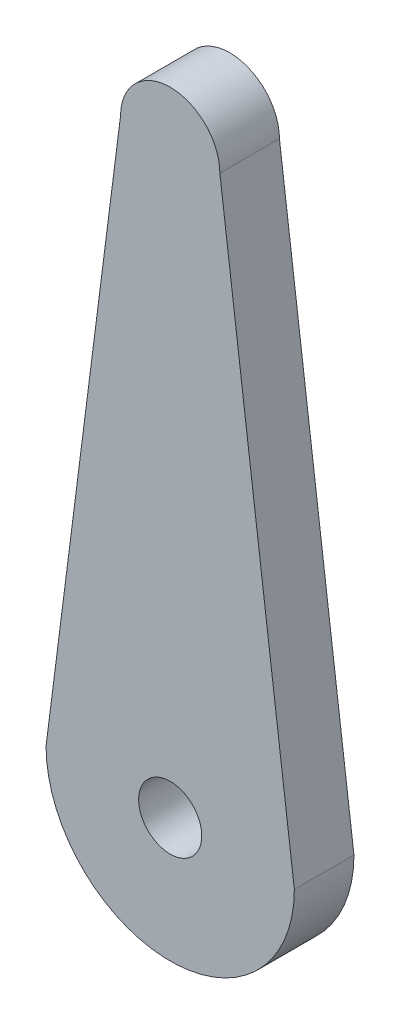
ISO-10303-21;
HEADER;
FILE_DESCRIPTION(('STEP AP214'),'2;1');
FILE_NAME('part.step','',(''),(''),'','','');
FILE_SCHEMA(('AUTOMOTIVE_DESIGN { 1 0 10303 214 1 1 1 1 }'));
ENDSEC;
DATA;
#1=APPLICATION_CONTEXT('core data for automotive mechanical design processes');
#2=APPLICATION_PROTOCOL_DEFINITION('international standard','automotive_design',2000,#1);
#3=PRODUCT_CONTEXT('',#1,'mechanical');
#4=PRODUCT('Part','Part','',(#3));
#5=PRODUCT_RELATED_PRODUCT_CATEGORY('part','',(#4));
#6=PRODUCT_DEFINITION_FORMATION('','',#4);
#7=PRODUCT_DEFINITION_CONTEXT('part definition',#1,'design');
#8=PRODUCT_DEFINITION('design','',#6,#7);
#9=PRODUCT_DEFINITION_SHAPE('','',#8);
#10=(LENGTH_UNIT() NAMED_UNIT(*) SI_UNIT(.MILLI.,.METRE.));
#11=(NAMED_UNIT(*) PLANE_ANGLE_UNIT() SI_UNIT($,.RADIAN.));
#12=(NAMED_UNIT(*) SI_UNIT($,.STERADIAN.) SOLID_ANGLE_UNIT());
#13=UNCERTAINTY_MEASURE_WITH_UNIT(LENGTH_MEASURE(1.E-05),#10,'distance_accuracy_value','');
#14=(GEOMETRIC_REPRESENTATION_CONTEXT(3) GLOBAL_UNCERTAINTY_ASSIGNED_CONTEXT((#13)) GLOBAL_UNIT_ASSIGNED_CONTEXT((#10,
#11,#12)) REPRESENTATION_CONTEXT('',''));
#15=CARTESIAN_POINT('',(0.,0.,0.));
#16=DIRECTION('',(0.,0.,1.));
#17=DIRECTION('',(1.,0.,0.));
#18=AXIS2_PLACEMENT_3D('',#15,#16,#17);
#19=CARTESIAN_POINT('',(0.,0.,6.));
#20=DIRECTION('',(0.,0.,-1.));
#21=DIRECTION('',(-1.,0.,0.));
#22=AXIS2_PLACEMENT_3D('',#19,#20,#21);
#23=CYLINDRICAL_SURFACE('',#22,12.5);
#24=CARTESIAN_POINT('',(0.,0.,0.));
#25=DIRECTION('',(0.,0.,1.));
#26=DIRECTION('',(1.,0.,0.));
#27=AXIS2_PLACEMENT_3D('',#24,#25,#26);
#28=CIRCLE('',#27,12.5);
#29=CARTESIAN_POINT('',(-12.5,0.,0.));
#30=VERTEX_POINT('',#29);
#31=CARTESIAN_POINT('',(12.5,0.,0.));
#32=VERTEX_POINT('',#31);
#33=EDGE_CURVE('E106',#30,#32,#28,.T.);
#34=ORIENTED_EDGE('',*,*,#33,.T.);
#35=DIRECTION('',(0.,0.,-1.));
#36=VECTOR('',#35,1.);
#37=CARTESIAN_POINT('',(12.5,0.,6.));
#38=LINE('',#37,#36);
#39=CARTESIAN_POINT('',(12.5,0.,6.));
#40=VERTEX_POINT('',#39);
#41=EDGE_CURVE('E11',#40,#32,#38,.T.);
#42=ORIENTED_EDGE('',*,*,#41,.F.);
#43=CARTESIAN_POINT('',(0.,0.,6.));
#44=DIRECTION('',(0.,0.,1.));
#45=DIRECTION('',(1.,0.,0.));
#46=AXIS2_PLACEMENT_3D('',#43,#44,#45);
#47=CIRCLE('',#46,12.5);
#48=CARTESIAN_POINT('',(-12.5,0.,6.));
#49=VERTEX_POINT('',#48);
#50=EDGE_CURVE('E93',#49,#40,#47,.T.);
#51=ORIENTED_EDGE('',*,*,#50,.F.);
#52=DIRECTION('',(0.,0.,-1.));
#53=VECTOR('',#52,1.);
#54=CARTESIAN_POINT('',(-12.5,0.,6.));
#55=LINE('',#54,#53);
#56=EDGE_CURVE('E102',#49,#30,#55,.T.);
#57=ORIENTED_EDGE('',*,*,#56,.T.);
#58=EDGE_LOOP('',(#34,#42,#51,#57));
#59=FACE_BOUND('',#58,.T.);
#60=ADVANCED_FACE('F41',(#59),#23,.T.);
#61=CARTESIAN_POINT('',(12.5,0.,6.));
#62=DIRECTION('',(-0.991936225095598,-0.12673801853862,0.));
#63=DIRECTION('',(0.12673801853862,-0.991936225095598,0.));
#64=AXIS2_PLACEMENT_3D('',#61,#62,#63);
#65=PLANE('',#64);
#66=DIRECTION('',(-0.12673801853862,0.991936225095598,0.));
#67=VECTOR('',#66,1.);
#68=CARTESIAN_POINT('',(12.5,0.,0.));
#69=LINE('',#68,#67);
#70=CARTESIAN_POINT('',(5.,58.7,0.));
#71=VERTEX_POINT('',#70);
#72=EDGE_CURVE('E97',#32,#71,#69,.T.);
#73=ORIENTED_EDGE('',*,*,#72,.T.);
#74=DIRECTION('',(0.,0.,-1.));
#75=VECTOR('',#74,1.);
#76=CARTESIAN_POINT('',(5.,58.7,6.));
#77=LINE('',#76,#75);
#78=CARTESIAN_POINT('',(5.,58.7,6.));
#79=VERTEX_POINT('',#78);
#80=EDGE_CURVE('E50',#79,#71,#77,.T.);
#81=ORIENTED_EDGE('',*,*,#80,.F.);
#82=DIRECTION('',(-0.12673801853862,0.991936225095598,0.));
#83=VECTOR('',#82,1.);
#84=CARTESIAN_POINT('',(12.5,0.,6.));
#85=LINE('',#84,#83);
#86=EDGE_CURVE('E88',#40,#79,#85,.T.);
#87=ORIENTED_EDGE('',*,*,#86,.F.);
#88=ORIENTED_EDGE('',*,*,#41,.T.);
#89=EDGE_LOOP('',(#73,#81,#87,#88));
#90=FACE_BOUND('',#89,.T.);
#91=ADVANCED_FACE('F96',(#90),#65,.F.);
#92=CARTESIAN_POINT('',(0.,58.7,6.));
#93=DIRECTION('',(0.,0.,-1.));
#94=DIRECTION('',(-1.,0.,0.));
#95=AXIS2_PLACEMENT_3D('',#92,#93,#94);
#96=CYLINDRICAL_SURFACE('',#95,5.);
#97=CARTESIAN_POINT('',(0.,58.7,0.));
#98=DIRECTION('',(0.,0.,1.));
#99=DIRECTION('',(1.,0.,0.));
#100=AXIS2_PLACEMENT_3D('',#97,#98,#99);
#101=CIRCLE('',#100,5.);
#102=CARTESIAN_POINT('',(-5.,58.7,0.));
#103=VERTEX_POINT('',#102);
#104=EDGE_CURVE('E75',#71,#103,#101,.T.);
#105=ORIENTED_EDGE('',*,*,#104,.T.);
#106=DIRECTION('',(0.,0.,-1.));
#107=VECTOR('',#106,1.);
#108=CARTESIAN_POINT('',(-5.,58.7,6.));
#109=LINE('',#108,#107);
#110=CARTESIAN_POINT('',(-5.,58.7,6.));
#111=VERTEX_POINT('',#110);
#112=EDGE_CURVE('E98',#111,#103,#109,.T.);
#113=ORIENTED_EDGE('',*,*,#112,.F.);
#114=CARTESIAN_POINT('',(0.,58.7,6.));
#115=DIRECTION('',(0.,0.,1.));
#116=DIRECTION('',(1.,0.,0.));
#117=AXIS2_PLACEMENT_3D('',#114,#115,#116);
#118=CIRCLE('',#117,5.);
#119=EDGE_CURVE('E91',#79,#111,#118,.T.);
#120=ORIENTED_EDGE('',*,*,#119,.F.);
#121=ORIENTED_EDGE('',*,*,#80,.T.);
#122=EDGE_LOOP('',(#105,#113,#120,#121));
#123=FACE_BOUND('',#122,.T.);
#124=ADVANCED_FACE('F100',(#123),#96,.T.);
#125=CARTESIAN_POINT('',(-12.5,0.,6.));
#126=DIRECTION('',(0.991936225095598,-0.12673801853862,0.));
#127=DIRECTION('',(0.12673801853862,0.991936225095598,0.));
#128=AXIS2_PLACEMENT_3D('',#125,#126,#127);
#129=PLANE('',#128);
#130=DIRECTION('',(-0.12673801853862,-0.991936225095598,0.));
#131=VECTOR('',#130,1.);
#132=CARTESIAN_POINT('',(-12.5,0.,0.));
#133=LINE('',#132,#131);
#134=EDGE_CURVE('E81',#103,#30,#133,.T.);
#135=ORIENTED_EDGE('',*,*,#134,.T.);
#136=ORIENTED_EDGE('',*,*,#56,.F.);
#137=DIRECTION('',(-0.12673801853862,-0.991936225095598,0.));
#138=VECTOR('',#137,1.);
#139=CARTESIAN_POINT('',(-12.5,0.,6.));
#140=LINE('',#139,#138);
#141=EDGE_CURVE('E58',#111,#49,#140,.T.);
#142=ORIENTED_EDGE('',*,*,#141,.F.);
#143=ORIENTED_EDGE('',*,*,#112,.T.);
#144=EDGE_LOOP('',(#135,#136,#142,#143));
#145=FACE_BOUND('',#144,.T.);
#146=ADVANCED_FACE('F113',(#145),#129,.F.);
#147=CARTESIAN_POINT('',(0.,0.,6.));
#148=DIRECTION('',(0.,0.,1.));
#149=DIRECTION('',(1.,0.,0.));
#150=AXIS2_PLACEMENT_3D('',#147,#148,#149);
#151=PLANE('',#150);
#152=CARTESIAN_POINT('',(0.,0.,6.));
#153=DIRECTION('',(0.,0.,1.));
#154=DIRECTION('',(1.,0.,0.));
#155=AXIS2_PLACEMENT_3D('',#152,#153,#154);
#156=CIRCLE('',#155,3.175);
#157=CARTESIAN_POINT('',(3.175,0.,6.));
#158=VERTEX_POINT('',#157);
#159=EDGE_CURVE('E119',#158,#158,#156,.T.);
#160=ORIENTED_EDGE('',*,*,#159,.F.);
#161=EDGE_LOOP('',(#160));
#162=FACE_BOUND('',#161,.T.);
#163=ORIENTED_EDGE('',*,*,#50,.T.);
#164=ORIENTED_EDGE('',*,*,#86,.T.);
#165=ORIENTED_EDGE('',*,*,#119,.T.);
#166=ORIENTED_EDGE('',*,*,#141,.T.);
#167=EDGE_LOOP('',(#163,#164,#165,#166));
#168=FACE_BOUND('',#167,.T.);
#169=ADVANCED_FACE('F89',(#162,#168),#151,.T.);
#170=CARTESIAN_POINT('',(0.,0.,0.));
#171=DIRECTION('',(0.,0.,1.));
#172=DIRECTION('',(1.,0.,0.));
#173=AXIS2_PLACEMENT_3D('',#170,#171,#172);
#174=PLANE('',#173);
#175=CARTESIAN_POINT('',(0.,0.,0.));
#176=DIRECTION('',(0.,0.,1.));
#177=DIRECTION('',(1.,0.,0.));
#178=AXIS2_PLACEMENT_3D('',#175,#176,#177);
#179=CIRCLE('',#178,3.175);
#180=CARTESIAN_POINT('',(3.175,0.,0.));
#181=VERTEX_POINT('',#180);
#182=EDGE_CURVE('E44',#181,#181,#179,.T.);
#183=ORIENTED_EDGE('',*,*,#182,.T.);
#184=EDGE_LOOP('',(#183));
#185=FACE_BOUND('',#184,.T.);
#186=ORIENTED_EDGE('',*,*,#33,.F.);
#187=ORIENTED_EDGE('',*,*,#134,.F.);
#188=ORIENTED_EDGE('',*,*,#104,.F.);
#189=ORIENTED_EDGE('',*,*,#72,.F.);
#190=EDGE_LOOP('',(#186,#187,#188,#189));
#191=FACE_BOUND('',#190,.T.);
#192=ADVANCED_FACE('F116',(#185,#191),#174,.F.);
#193=CARTESIAN_POINT('',(0.,0.,-15.));
#194=DIRECTION('',(0.,0.,1.));
#195=DIRECTION('',(1.,0.,0.));
#196=AXIS2_PLACEMENT_3D('',#193,#194,#195);
#197=CYLINDRICAL_SURFACE('',#196,3.175);
#198=CARTESIAN_POINT('',(3.175,0.,6.));
#199=CARTESIAN_POINT('',(3.175,0.,5.9375));
#200=CARTESIAN_POINT('',(3.175,0.,5.875));
#201=CARTESIAN_POINT('',(3.175,0.,5.75));
#202=CARTESIAN_POINT('',(3.175,0.,5.6875));
#203=CARTESIAN_POINT('',(3.175,0.,5.5625));
#204=CARTESIAN_POINT('',(3.175,0.,5.5));
#205=CARTESIAN_POINT('',(3.175,0.,5.375));
#206=CARTESIAN_POINT('',(3.175,0.,5.3125));
#207=CARTESIAN_POINT('',(3.175,0.,5.1875));
#208=CARTESIAN_POINT('',(3.175,0.,5.125));
#209=CARTESIAN_POINT('',(3.175,0.,5.));
#210=CARTESIAN_POINT('',(3.175,0.,4.9375));
#211=CARTESIAN_POINT('',(3.175,0.,4.8125));
#212=CARTESIAN_POINT('',(3.175,0.,4.75));
#213=CARTESIAN_POINT('',(3.175,0.,4.625));
#214=CARTESIAN_POINT('',(3.175,0.,4.5625));
#215=CARTESIAN_POINT('',(3.175,0.,4.4375));
#216=CARTESIAN_POINT('',(3.175,0.,4.375));
#217=CARTESIAN_POINT('',(3.175,0.,4.25));
#218=CARTESIAN_POINT('',(3.175,0.,4.1875));
#219=CARTESIAN_POINT('',(3.175,0.,4.0625));
#220=CARTESIAN_POINT('',(3.175,0.,4.));
#221=CARTESIAN_POINT('',(3.175,0.,3.875));
#222=CARTESIAN_POINT('',(3.175,0.,3.8125));
#223=CARTESIAN_POINT('',(3.175,0.,3.6875));
#224=CARTESIAN_POINT('',(3.175,0.,3.625));
#225=CARTESIAN_POINT('',(3.175,0.,3.5));
#226=CARTESIAN_POINT('',(3.175,0.,3.4375));
#227=CARTESIAN_POINT('',(3.175,0.,3.3125));
#228=CARTESIAN_POINT('',(3.175,0.,3.25));
#229=CARTESIAN_POINT('',(3.175,0.,3.125));
#230=CARTESIAN_POINT('',(3.175,0.,3.0625));
#231=CARTESIAN_POINT('',(3.175,0.,2.9375));
#232=CARTESIAN_POINT('',(3.175,0.,2.875));
#233=CARTESIAN_POINT('',(3.175,0.,2.75));
#234=CARTESIAN_POINT('',(3.175,0.,2.6875));
#235=CARTESIAN_POINT('',(3.175,0.,2.5625));
#236=CARTESIAN_POINT('',(3.175,0.,2.5));
#237=CARTESIAN_POINT('',(3.175,0.,2.375));
#238=CARTESIAN_POINT('',(3.175,0.,2.3125));
#239=CARTESIAN_POINT('',(3.175,0.,2.1875));
#240=CARTESIAN_POINT('',(3.175,0.,2.125));
#241=CARTESIAN_POINT('',(3.175,0.,2.));
#242=CARTESIAN_POINT('',(3.175,0.,1.9375));
#243=CARTESIAN_POINT('',(3.175,0.,1.8125));
#244=CARTESIAN_POINT('',(3.175,0.,1.75));
#245=CARTESIAN_POINT('',(3.175,0.,1.625));
#246=CARTESIAN_POINT('',(3.175,0.,1.5625));
#247=CARTESIAN_POINT('',(3.175,0.,1.4375));
#248=CARTESIAN_POINT('',(3.175,0.,1.375));
#249=CARTESIAN_POINT('',(3.175,0.,1.25));
#250=CARTESIAN_POINT('',(3.175,0.,1.1875));
#251=CARTESIAN_POINT('',(3.175,0.,1.0625));
#252=CARTESIAN_POINT('',(3.175,0.,0.999999999999999));
#253=CARTESIAN_POINT('',(3.175,0.,0.874999999999999));
#254=CARTESIAN_POINT('',(3.175,0.,0.812499999999999));
#255=CARTESIAN_POINT('',(3.175,0.,0.687499999999999));
#256=CARTESIAN_POINT('',(3.175,0.,0.625));
#257=CARTESIAN_POINT('',(3.175,0.,0.5));
#258=CARTESIAN_POINT('',(3.175,0.,0.4375));
#259=CARTESIAN_POINT('',(3.175,0.,0.3125));
#260=CARTESIAN_POINT('',(3.175,0.,0.25));
#261=CARTESIAN_POINT('',(3.175,0.,0.125));
#262=CARTESIAN_POINT('',(3.175,0.,0.0625000000000001));
#263=CARTESIAN_POINT('',(3.175,0.,0.));
#264=B_SPLINE_CURVE_WITH_KNOTS('',3,(#198,#199,#200,#201,#202,#203,#204,#205,#206,#207,#208,
#209,#210,#211,#212,#213,#214,#215,#216,#217,#218,#219,#220,#221,#222,#223,#224,#225,#226,#227,
#228,#229,#230,#231,#232,#233,#234,#235,#236,#237,#238,#239,#240,#241,#242,#243,#244,#245,#246,
#247,#248,#249,#250,#251,#252,#253,#254,#255,#256,#257,#258,#259,#260,#261,#262,#263),
.UNSPECIFIED.,.F.,.F.,(4,2,2,2,2,2,2,2,2,2,2,2,2,2,2,2,2,2,2,2,2,2,2,2,2,2,2,2,2,2,2,2,4),(0.,
0.1875,0.375,0.5625,0.750000000000001,0.937500000000001,1.125,1.3125,1.5,1.6875,1.875,2.0625,
2.25,2.4375,2.625,2.8125,3.,3.1875,3.375,3.5625,3.75,3.9375,4.125,4.3125,4.5,4.6875,4.875,
5.0625,5.25,5.4375,5.625,5.8125,6.),.UNSPECIFIED.);
#265=EDGE_CURVE('BSEAM127',#158,#181,#264,.T.);
#266=ORIENTED_EDGE('',*,*,#159,.T.);
#267=ORIENTED_EDGE('',*,*,#182,.F.);
#268=ORIENTED_EDGE('',*,*,#265,.T.);
#269=ORIENTED_EDGE('',*,*,#265,.F.);
#270=EDGE_LOOP('',(#266,#268,#267,#269));
#271=FACE_BOUND('',#270,.T.);
#272=ADVANCED_FACE('F127',(#271),#197,.F.);
#273=CLOSED_SHELL('',(#60,#91,#124,#146,#169,#192,#272));
#274=MANIFOLD_SOLID_BREP('B2',#273);
#275=ADVANCED_BREP_SHAPE_REPRESENTATION('',(#18,#274),#14);
#276=SHAPE_DEFINITION_REPRESENTATION(#9,#275);
ENDSEC;
END-ISO-10303-21;
